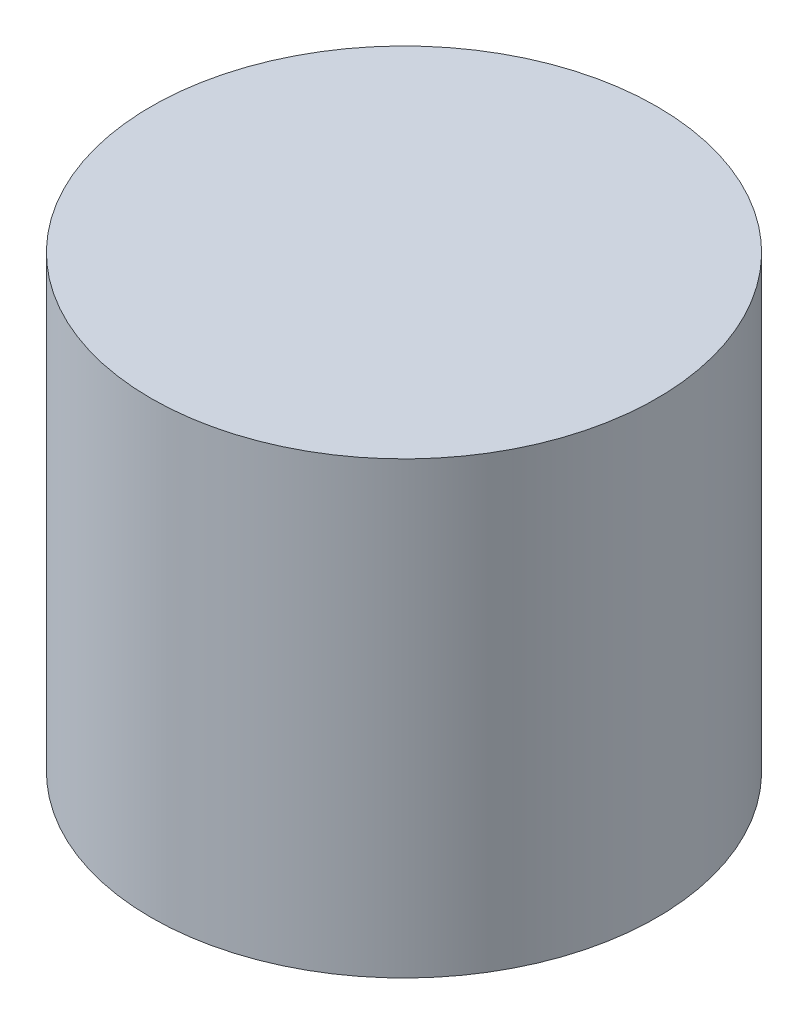
ISO-10303-21;
HEADER;
FILE_DESCRIPTION(('STEP AP214'),'2;1');
FILE_NAME('part.step','',(''),(''),'','','');
FILE_SCHEMA(('AUTOMOTIVE_DESIGN { 1 0 10303 214 1 1 1 1 }'));
ENDSEC;
DATA;
#1=APPLICATION_CONTEXT('core data for automotive mechanical design processes');
#2=APPLICATION_PROTOCOL_DEFINITION('international standard','automotive_design',2000,#1);
#3=PRODUCT_CONTEXT('',#1,'mechanical');
#4=PRODUCT('Part','Part','',(#3));
#5=PRODUCT_RELATED_PRODUCT_CATEGORY('part','',(#4));
#6=PRODUCT_DEFINITION_FORMATION('','',#4);
#7=PRODUCT_DEFINITION_CONTEXT('part definition',#1,'design');
#8=PRODUCT_DEFINITION('design','',#6,#7);
#9=PRODUCT_DEFINITION_SHAPE('','',#8);
#10=(LENGTH_UNIT() NAMED_UNIT(*) SI_UNIT(.MILLI.,.METRE.));
#11=(NAMED_UNIT(*) PLANE_ANGLE_UNIT() SI_UNIT($,.RADIAN.));
#12=(NAMED_UNIT(*) SI_UNIT($,.STERADIAN.) SOLID_ANGLE_UNIT());
#13=UNCERTAINTY_MEASURE_WITH_UNIT(LENGTH_MEASURE(1.E-05),#10,'distance_accuracy_value','');
#14=(GEOMETRIC_REPRESENTATION_CONTEXT(3) GLOBAL_UNCERTAINTY_ASSIGNED_CONTEXT((#13)) GLOBAL_UNIT_ASSIGNED_CONTEXT((#10,
#11,#12)) REPRESENTATION_CONTEXT('',''));
#15=CARTESIAN_POINT('',(0.,0.,0.));
#16=DIRECTION('',(0.,0.,1.));
#17=DIRECTION('',(1.,0.,0.));
#18=AXIS2_PLACEMENT_3D('',#15,#16,#17);
#19=CARTESIAN_POINT('',(0.,40.,0.));
#20=DIRECTION('',(0.,-1.,0.));
#21=DIRECTION('',(0.,0.,-1.));
#22=AXIS2_PLACEMENT_3D('',#19,#20,#21);
#23=CYLINDRICAL_SURFACE('',#22,22.5);
#24=CARTESIAN_POINT('',(0.,40.,0.));
#25=DIRECTION('',(0.,1.,0.));
#26=DIRECTION('',(0.,0.,1.));
#27=AXIS2_PLACEMENT_3D('',#24,#25,#26);
#28=CIRCLE('',#27,22.5);
#29=CARTESIAN_POINT('',(0.,40.,22.5));
#30=VERTEX_POINT('',#29);
#31=EDGE_CURVE('E10',#30,#30,#28,.T.);
#32=ORIENTED_EDGE('',*,*,#31,.F.);
#33=EDGE_LOOP('',(#32));
#34=FACE_BOUND('',#33,.T.);
#35=CARTESIAN_POINT('',(0.,0.,0.));
#36=DIRECTION('',(0.,1.,0.));
#37=DIRECTION('',(0.,0.,1.));
#38=AXIS2_PLACEMENT_3D('',#35,#36,#37);
#39=CIRCLE('',#38,22.5);
#40=CARTESIAN_POINT('',(0.,0.,22.5));
#41=VERTEX_POINT('',#40);
#42=EDGE_CURVE('E37',#41,#41,#39,.T.);
#43=ORIENTED_EDGE('',*,*,#42,.T.);
#44=EDGE_LOOP('',(#43));
#45=FACE_BOUND('',#44,.T.);
#46=ADVANCED_FACE('F34',(#34,#45),#23,.T.);
#47=CARTESIAN_POINT('',(0.,40.,0.));
#48=DIRECTION('',(0.,1.,0.));
#49=DIRECTION('',(0.,0.,1.));
#50=AXIS2_PLACEMENT_3D('',#47,#48,#49);
#51=PLANE('',#50);
#52=ORIENTED_EDGE('',*,*,#31,.T.);
#53=EDGE_LOOP('',(#52));
#54=FACE_BOUND('',#53,.T.);
#55=ADVANCED_FACE('F51',(#54),#51,.T.);
#56=CARTESIAN_POINT('',(0.,0.,0.));
#57=DIRECTION('',(0.,1.,0.));
#58=DIRECTION('',(0.,0.,1.));
#59=AXIS2_PLACEMENT_3D('',#56,#57,#58);
#60=PLANE('',#59);
#61=ORIENTED_EDGE('',*,*,#42,.F.);
#62=EDGE_LOOP('',(#61));
#63=FACE_BOUND('',#62,.T.);
#64=ADVANCED_FACE('F49',(#63),#60,.F.);
#65=CLOSED_SHELL('',(#46,#55,#64));
#66=MANIFOLD_SOLID_BREP('B2',#65);
#67=ADVANCED_BREP_SHAPE_REPRESENTATION('',(#18,#66),#14);
#68=SHAPE_DEFINITION_REPRESENTATION(#9,#67);
ENDSEC;
END-ISO-10303-21;
